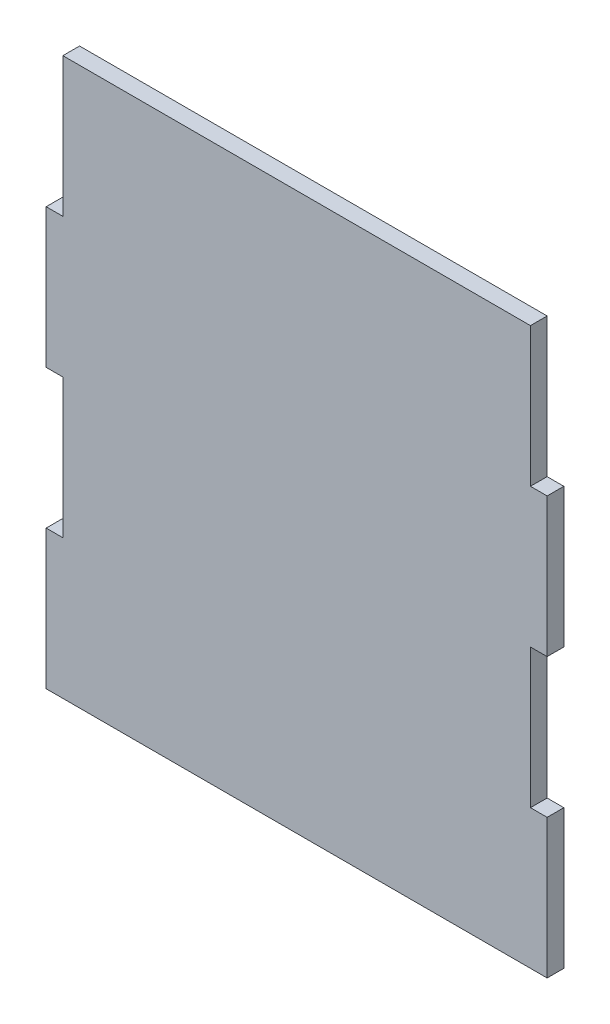
ISO-10303-21;
HEADER;
FILE_DESCRIPTION(('STEP AP214'),'2;1');
FILE_NAME('part.step','',(''),(''),'','','');
FILE_SCHEMA(('AUTOMOTIVE_DESIGN { 1 0 10303 214 1 1 1 1 }'));
ENDSEC;
DATA;
#1=APPLICATION_CONTEXT('core data for automotive mechanical design processes');
#2=APPLICATION_PROTOCOL_DEFINITION('international standard','automotive_design',2000,#1);
#3=PRODUCT_CONTEXT('',#1,'mechanical');
#4=PRODUCT('Part','Part','',(#3));
#5=PRODUCT_RELATED_PRODUCT_CATEGORY('part','',(#4));
#6=PRODUCT_DEFINITION_FORMATION('','',#4);
#7=PRODUCT_DEFINITION_CONTEXT('part definition',#1,'design');
#8=PRODUCT_DEFINITION('design','',#6,#7);
#9=PRODUCT_DEFINITION_SHAPE('','',#8);
#10=(LENGTH_UNIT() NAMED_UNIT(*) SI_UNIT(.MILLI.,.METRE.));
#11=(NAMED_UNIT(*) PLANE_ANGLE_UNIT() SI_UNIT($,.RADIAN.));
#12=(NAMED_UNIT(*) SI_UNIT($,.STERADIAN.) SOLID_ANGLE_UNIT());
#13=UNCERTAINTY_MEASURE_WITH_UNIT(LENGTH_MEASURE(1.E-05),#10,'distance_accuracy_value','');
#14=(GEOMETRIC_REPRESENTATION_CONTEXT(3) GLOBAL_UNCERTAINTY_ASSIGNED_CONTEXT((#13)) GLOBAL_UNIT_ASSIGNED_CONTEXT((#10,
#11,#12)) REPRESENTATION_CONTEXT('',''));
#15=CARTESIAN_POINT('',(0.,0.,0.));
#16=DIRECTION('',(0.,0.,1.));
#17=DIRECTION('',(1.,0.,0.));
#18=AXIS2_PLACEMENT_3D('',#15,#16,#17);
#19=CARTESIAN_POINT('',(0.,0.,3.));
#20=DIRECTION('',(1.,0.,0.));
#21=DIRECTION('',(0.,0.,-1.));
#22=AXIS2_PLACEMENT_3D('',#19,#20,#21);
#23=PLANE('',#22);
#24=DIRECTION('',(0.,-1.,0.));
#25=VECTOR('',#24,1.);
#26=CARTESIAN_POINT('',(0.,0.,0.));
#27=LINE('',#26,#25);
#28=CARTESIAN_POINT('',(0.,75.,0.));
#29=VERTEX_POINT('',#28);
#30=CARTESIAN_POINT('',(0.,50.,0.));
#31=VERTEX_POINT('',#30);
#32=EDGE_CURVE('E203',#29,#31,#27,.T.);
#33=ORIENTED_EDGE('',*,*,#32,.T.);
#34=DIRECTION('',(0.,0.,1.));
#35=VECTOR('',#34,1.);
#36=CARTESIAN_POINT('',(0.,50.,0.));
#37=LINE('',#36,#35);
#38=CARTESIAN_POINT('',(0.,50.,3.));
#39=VERTEX_POINT('',#38);
#40=EDGE_CURVE('E251',#31,#39,#37,.T.);
#41=ORIENTED_EDGE('',*,*,#40,.T.);
#42=DIRECTION('',(0.,-1.,0.));
#43=VECTOR('',#42,1.);
#44=CARTESIAN_POINT('',(0.,0.,3.));
#45=LINE('',#44,#43);
#46=CARTESIAN_POINT('',(0.,75.,3.));
#47=VERTEX_POINT('',#46);
#48=EDGE_CURVE('E321',#47,#39,#45,.T.);
#49=ORIENTED_EDGE('',*,*,#48,.F.);
#50=DIRECTION('',(0.,0.,1.));
#51=VECTOR('',#50,1.);
#52=CARTESIAN_POINT('',(0.,75.,0.));
#53=LINE('',#52,#51);
#54=EDGE_CURVE('E307',#29,#47,#53,.T.);
#55=ORIENTED_EDGE('',*,*,#54,.F.);
#56=EDGE_LOOP('',(#33,#41,#49,#55));
#57=FACE_BOUND('',#56,.T.);
#58=ADVANCED_FACE('F43',(#57),#23,.F.);
#59=CARTESIAN_POINT('',(90.,0.,3.));
#60=DIRECTION('',(-1.,0.,0.));
#61=DIRECTION('',(0.,0.,1.));
#62=AXIS2_PLACEMENT_3D('',#59,#60,#61);
#63=PLANE('',#62);
#64=DIRECTION('',(0.,1.,0.));
#65=VECTOR('',#64,1.);
#66=CARTESIAN_POINT('',(90.,0.,0.));
#67=LINE('',#66,#65);
#68=CARTESIAN_POINT('',(90.,0.,0.));
#69=VERTEX_POINT('',#68);
#70=CARTESIAN_POINT('',(90.,25.,0.));
#71=VERTEX_POINT('',#70);
#72=EDGE_CURVE('E178',#69,#71,#67,.T.);
#73=ORIENTED_EDGE('',*,*,#72,.T.);
#74=DIRECTION('',(0.,0.,1.));
#75=VECTOR('',#74,1.);
#76=CARTESIAN_POINT('',(90.,25.,0.));
#77=LINE('',#76,#75);
#78=CARTESIAN_POINT('',(90.,25.,3.));
#79=VERTEX_POINT('',#78);
#80=EDGE_CURVE('E160',#71,#79,#77,.T.);
#81=ORIENTED_EDGE('',*,*,#80,.T.);
#82=DIRECTION('',(0.,1.,0.));
#83=VECTOR('',#82,1.);
#84=CARTESIAN_POINT('',(90.,0.,3.));
#85=LINE('',#84,#83);
#86=CARTESIAN_POINT('',(90.,0.,3.));
#87=VERTEX_POINT('',#86);
#88=EDGE_CURVE('E176',#87,#79,#85,.T.);
#89=ORIENTED_EDGE('',*,*,#88,.F.);
#90=DIRECTION('',(0.,0.,-1.));
#91=VECTOR('',#90,1.);
#92=CARTESIAN_POINT('',(90.,0.,3.));
#93=LINE('',#92,#91);
#94=EDGE_CURVE('E52',#87,#69,#93,.T.);
#95=ORIENTED_EDGE('',*,*,#94,.T.);
#96=EDGE_LOOP('',(#73,#81,#89,#95));
#97=FACE_BOUND('',#96,.T.);
#98=ADVANCED_FACE('F174',(#97),#63,.F.);
#99=CARTESIAN_POINT('',(0.,25.,3.));
#100=VERTEX_POINT('',#99);
#101=CARTESIAN_POINT('',(0.,0.,3.));
#102=VERTEX_POINT('',#101);
#103=EDGE_CURVE('E214',#100,#102,#45,.T.);
#104=ORIENTED_EDGE('',*,*,#103,.F.);
#105=DIRECTION('',(0.,0.,1.));
#106=VECTOR('',#105,1.);
#107=CARTESIAN_POINT('',(0.,25.,0.));
#108=LINE('',#107,#106);
#109=CARTESIAN_POINT('',(0.,25.,0.));
#110=VERTEX_POINT('',#109);
#111=EDGE_CURVE('E241',#110,#100,#108,.T.);
#112=ORIENTED_EDGE('',*,*,#111,.F.);
#113=CARTESIAN_POINT('',(0.,0.,0.));
#114=VERTEX_POINT('',#113);
#115=EDGE_CURVE('E200',#110,#114,#27,.T.);
#116=ORIENTED_EDGE('',*,*,#115,.T.);
#117=DIRECTION('',(0.,0.,-1.));
#118=VECTOR('',#117,1.);
#119=CARTESIAN_POINT('',(0.,0.,3.));
#120=LINE('',#119,#118);
#121=EDGE_CURVE('E11',#102,#114,#120,.T.);
#122=ORIENTED_EDGE('',*,*,#121,.F.);
#123=EDGE_LOOP('',(#104,#112,#116,#122));
#124=FACE_BOUND('',#123,.T.);
#125=ADVANCED_FACE('F45',(#124),#23,.F.);
#126=CARTESIAN_POINT('',(0.,0.,3.));
#127=DIRECTION('',(0.,1.,0.));
#128=DIRECTION('',(0.,0.,1.));
#129=AXIS2_PLACEMENT_3D('',#126,#127,#128);
#130=PLANE('',#129);
#131=DIRECTION('',(1.,0.,0.));
#132=VECTOR('',#131,1.);
#133=CARTESIAN_POINT('',(0.,0.,0.));
#134=LINE('',#133,#132);
#135=EDGE_CURVE('E205',#114,#69,#134,.T.);
#136=ORIENTED_EDGE('',*,*,#135,.T.);
#137=ORIENTED_EDGE('',*,*,#94,.F.);
#138=DIRECTION('',(1.,0.,0.));
#139=VECTOR('',#138,1.);
#140=CARTESIAN_POINT('',(0.,0.,3.));
#141=LINE('',#140,#139);
#142=EDGE_CURVE('E184',#102,#87,#141,.T.);
#143=ORIENTED_EDGE('',*,*,#142,.F.);
#144=ORIENTED_EDGE('',*,*,#121,.T.);
#145=EDGE_LOOP('',(#136,#137,#143,#144));
#146=FACE_BOUND('',#145,.T.);
#147=ADVANCED_FACE('F347',(#146),#130,.F.);
#148=CARTESIAN_POINT('',(90.,50.,0.));
#149=VERTEX_POINT('',#148);
#150=CARTESIAN_POINT('',(90.,75.,0.));
#151=VERTEX_POINT('',#150);
#152=EDGE_CURVE('E208',#149,#151,#67,.T.);
#153=ORIENTED_EDGE('',*,*,#152,.T.);
#154=DIRECTION('',(0.,0.,1.));
#155=VECTOR('',#154,1.);
#156=CARTESIAN_POINT('',(90.,75.,0.));
#157=LINE('',#156,#155);
#158=CARTESIAN_POINT('',(90.,75.,3.));
#159=VERTEX_POINT('',#158);
#160=EDGE_CURVE('E282',#151,#159,#157,.T.);
#161=ORIENTED_EDGE('',*,*,#160,.T.);
#162=CARTESIAN_POINT('',(90.,50.,3.));
#163=VERTEX_POINT('',#162);
#164=EDGE_CURVE('E188',#163,#159,#85,.T.);
#165=ORIENTED_EDGE('',*,*,#164,.F.);
#166=DIRECTION('',(0.,0.,1.));
#167=VECTOR('',#166,1.);
#168=CARTESIAN_POINT('',(90.,50.,0.));
#169=LINE('',#168,#167);
#170=EDGE_CURVE('E227',#149,#163,#169,.T.);
#171=ORIENTED_EDGE('',*,*,#170,.F.);
#172=EDGE_LOOP('',(#153,#161,#165,#171));
#173=FACE_BOUND('',#172,.T.);
#174=ADVANCED_FACE('F349',(#173),#63,.F.);
#175=CARTESIAN_POINT('',(0.,100.,3.));
#176=DIRECTION('',(0.,-1.,0.));
#177=DIRECTION('',(0.,0.,-1.));
#178=AXIS2_PLACEMENT_3D('',#175,#176,#177);
#179=PLANE('',#178);
#180=DIRECTION('',(-1.,0.,0.));
#181=VECTOR('',#180,1.);
#182=CARTESIAN_POINT('',(0.,100.,3.));
#183=LINE('',#182,#181);
#184=CARTESIAN_POINT('',(87.,100.,3.));
#185=VERTEX_POINT('',#184);
#186=CARTESIAN_POINT('',(3.,100.,3.));
#187=VERTEX_POINT('',#186);
#188=EDGE_CURVE('E187',#185,#187,#183,.T.);
#189=ORIENTED_EDGE('',*,*,#188,.F.);
#190=DIRECTION('',(0.,0.,1.));
#191=VECTOR('',#190,1.);
#192=CARTESIAN_POINT('',(87.,100.,0.));
#193=LINE('',#192,#191);
#194=CARTESIAN_POINT('',(87.,100.,0.));
#195=VERTEX_POINT('',#194);
#196=EDGE_CURVE('E276',#195,#185,#193,.T.);
#197=ORIENTED_EDGE('',*,*,#196,.F.);
#198=DIRECTION('',(-1.,0.,0.));
#199=VECTOR('',#198,1.);
#200=CARTESIAN_POINT('',(0.,100.,0.));
#201=LINE('',#200,#199);
#202=CARTESIAN_POINT('',(3.,100.,0.));
#203=VERTEX_POINT('',#202);
#204=EDGE_CURVE('E211',#195,#203,#201,.T.);
#205=ORIENTED_EDGE('',*,*,#204,.T.);
#206=DIRECTION('',(0.,0.,1.));
#207=VECTOR('',#206,1.);
#208=CARTESIAN_POINT('',(3.,100.,0.));
#209=LINE('',#208,#207);
#210=EDGE_CURVE('E204',#203,#187,#209,.T.);
#211=ORIENTED_EDGE('',*,*,#210,.T.);
#212=EDGE_LOOP('',(#189,#197,#205,#211));
#213=FACE_BOUND('',#212,.T.);
#214=ADVANCED_FACE('F354',(#213),#179,.F.);
#215=CARTESIAN_POINT('',(0.,0.,3.));
#216=DIRECTION('',(0.,0.,-1.));
#217=DIRECTION('',(-1.,0.,0.));
#218=AXIS2_PLACEMENT_3D('',#215,#216,#217);
#219=PLANE('',#218);
#220=ORIENTED_EDGE('',*,*,#48,.T.);
#221=DIRECTION('',(-1.,0.,0.));
#222=VECTOR('',#221,1.);
#223=CARTESIAN_POINT('',(0.,50.,3.));
#224=LINE('',#223,#222);
#225=CARTESIAN_POINT('',(3.,50.,3.));
#226=VERTEX_POINT('',#225);
#227=EDGE_CURVE('E256',#226,#39,#224,.T.);
#228=ORIENTED_EDGE('',*,*,#227,.F.);
#229=DIRECTION('',(0.,1.,0.));
#230=VECTOR('',#229,1.);
#231=CARTESIAN_POINT('',(3.,50.,3.));
#232=LINE('',#231,#230);
#233=CARTESIAN_POINT('',(3.,25.,3.));
#234=VERTEX_POINT('',#233);
#235=EDGE_CURVE('E259',#234,#226,#232,.T.);
#236=ORIENTED_EDGE('',*,*,#235,.F.);
#237=DIRECTION('',(1.,0.,0.));
#238=VECTOR('',#237,1.);
#239=CARTESIAN_POINT('',(0.,25.,3.));
#240=LINE('',#239,#238);
#241=EDGE_CURVE('E264',#100,#234,#240,.T.);
#242=ORIENTED_EDGE('',*,*,#241,.F.);
#243=ORIENTED_EDGE('',*,*,#103,.T.);
#244=ORIENTED_EDGE('',*,*,#142,.T.);
#245=ORIENTED_EDGE('',*,*,#88,.T.);
#246=DIRECTION('',(1.,0.,0.));
#247=VECTOR('',#246,1.);
#248=CARTESIAN_POINT('',(90.,25.,3.));
#249=LINE('',#248,#247);
#250=CARTESIAN_POINT('',(87.,25.,3.));
#251=VERTEX_POINT('',#250);
#252=EDGE_CURVE('E156',#251,#79,#249,.T.);
#253=ORIENTED_EDGE('',*,*,#252,.F.);
#254=DIRECTION('',(0.,-1.,0.));
#255=VECTOR('',#254,1.);
#256=CARTESIAN_POINT('',(87.,50.,3.));
#257=LINE('',#256,#255);
#258=CARTESIAN_POINT('',(87.,50.,3.));
#259=VERTEX_POINT('',#258);
#260=EDGE_CURVE('E168',#259,#251,#257,.T.);
#261=ORIENTED_EDGE('',*,*,#260,.F.);
#262=DIRECTION('',(-1.,0.,0.));
#263=VECTOR('',#262,1.);
#264=CARTESIAN_POINT('',(90.,50.,3.));
#265=LINE('',#264,#263);
#266=EDGE_CURVE('E236',#163,#259,#265,.T.);
#267=ORIENTED_EDGE('',*,*,#266,.F.);
#268=ORIENTED_EDGE('',*,*,#164,.T.);
#269=DIRECTION('',(1.,0.,0.));
#270=VECTOR('',#269,1.);
#271=CARTESIAN_POINT('',(90.,75.,3.));
#272=LINE('',#271,#270);
#273=CARTESIAN_POINT('',(87.,75.,3.));
#274=VERTEX_POINT('',#273);
#275=EDGE_CURVE('E286',#274,#159,#272,.T.);
#276=ORIENTED_EDGE('',*,*,#275,.F.);
#277=DIRECTION('',(0.,-1.,0.));
#278=VECTOR('',#277,1.);
#279=CARTESIAN_POINT('',(87.,100.,3.));
#280=LINE('',#279,#278);
#281=EDGE_CURVE('E255',#185,#274,#280,.T.);
#282=ORIENTED_EDGE('',*,*,#281,.F.);
#283=ORIENTED_EDGE('',*,*,#188,.T.);
#284=DIRECTION('',(0.,1.,0.));
#285=VECTOR('',#284,1.);
#286=CARTESIAN_POINT('',(3.,100.,3.));
#287=LINE('',#286,#285);
#288=CARTESIAN_POINT('',(3.,75.,3.));
#289=VERTEX_POINT('',#288);
#290=EDGE_CURVE('E303',#289,#187,#287,.T.);
#291=ORIENTED_EDGE('',*,*,#290,.F.);
#292=DIRECTION('',(1.,0.,0.));
#293=VECTOR('',#292,1.);
#294=CARTESIAN_POINT('',(0.,75.,3.));
#295=LINE('',#294,#293);
#296=EDGE_CURVE('E268',#47,#289,#295,.T.);
#297=ORIENTED_EDGE('',*,*,#296,.F.);
#298=EDGE_LOOP('',(#220,#228,#236,#242,#243,#244,#245,#253,#261,#267,#268,#276,#282,#283,#291,#297));
#299=FACE_BOUND('',#298,.T.);
#300=ADVANCED_FACE('F182',(#299),#219,.F.);
#301=CARTESIAN_POINT('',(0.,0.,0.));
#302=DIRECTION('',(0.,0.,-1.));
#303=DIRECTION('',(-1.,0.,0.));
#304=AXIS2_PLACEMENT_3D('',#301,#302,#303);
#305=PLANE('',#304);
#306=DIRECTION('',(-1.,0.,0.));
#307=VECTOR('',#306,1.);
#308=CARTESIAN_POINT('',(0.,50.,0.));
#309=LINE('',#308,#307);
#310=CARTESIAN_POINT('',(3.,50.,0.));
#311=VERTEX_POINT('',#310);
#312=EDGE_CURVE('E244',#311,#31,#309,.T.);
#313=ORIENTED_EDGE('',*,*,#312,.T.);
#314=ORIENTED_EDGE('',*,*,#32,.F.);
#315=DIRECTION('',(1.,0.,0.));
#316=VECTOR('',#315,1.);
#317=CARTESIAN_POINT('',(0.,75.,0.));
#318=LINE('',#317,#316);
#319=CARTESIAN_POINT('',(3.,75.,0.));
#320=VERTEX_POINT('',#319);
#321=EDGE_CURVE('E298',#29,#320,#318,.T.);
#322=ORIENTED_EDGE('',*,*,#321,.T.);
#323=DIRECTION('',(0.,1.,0.));
#324=VECTOR('',#323,1.);
#325=CARTESIAN_POINT('',(3.,100.,0.));
#326=LINE('',#325,#324);
#327=EDGE_CURVE('E302',#320,#203,#326,.T.);
#328=ORIENTED_EDGE('',*,*,#327,.T.);
#329=ORIENTED_EDGE('',*,*,#204,.F.);
#330=DIRECTION('',(0.,-1.,0.));
#331=VECTOR('',#330,1.);
#332=CARTESIAN_POINT('',(87.,100.,0.));
#333=LINE('',#332,#331);
#334=CARTESIAN_POINT('',(87.,75.,0.));
#335=VERTEX_POINT('',#334);
#336=EDGE_CURVE('E289',#195,#335,#333,.T.);
#337=ORIENTED_EDGE('',*,*,#336,.T.);
#338=DIRECTION('',(1.,0.,0.));
#339=VECTOR('',#338,1.);
#340=CARTESIAN_POINT('',(90.,75.,0.));
#341=LINE('',#340,#339);
#342=EDGE_CURVE('E67',#335,#151,#341,.T.);
#343=ORIENTED_EDGE('',*,*,#342,.T.);
#344=ORIENTED_EDGE('',*,*,#152,.F.);
#345=DIRECTION('',(-1.,0.,0.));
#346=VECTOR('',#345,1.);
#347=CARTESIAN_POINT('',(90.,50.,0.));
#348=LINE('',#347,#346);
#349=CARTESIAN_POINT('',(87.,50.,0.));
#350=VERTEX_POINT('',#349);
#351=EDGE_CURVE('E169',#149,#350,#348,.T.);
#352=ORIENTED_EDGE('',*,*,#351,.T.);
#353=DIRECTION('',(0.,-1.,0.));
#354=VECTOR('',#353,1.);
#355=CARTESIAN_POINT('',(87.,50.,0.));
#356=LINE('',#355,#354);
#357=CARTESIAN_POINT('',(87.,25.,0.));
#358=VERTEX_POINT('',#357);
#359=EDGE_CURVE('E225',#350,#358,#356,.T.);
#360=ORIENTED_EDGE('',*,*,#359,.T.);
#361=DIRECTION('',(1.,0.,0.));
#362=VECTOR('',#361,1.);
#363=CARTESIAN_POINT('',(90.,25.,0.));
#364=LINE('',#363,#362);
#365=EDGE_CURVE('E223',#358,#71,#364,.T.);
#366=ORIENTED_EDGE('',*,*,#365,.T.);
#367=ORIENTED_EDGE('',*,*,#72,.F.);
#368=ORIENTED_EDGE('',*,*,#135,.F.);
#369=ORIENTED_EDGE('',*,*,#115,.F.);
#370=DIRECTION('',(1.,0.,0.));
#371=VECTOR('',#370,1.);
#372=CARTESIAN_POINT('',(0.,25.,0.));
#373=LINE('',#372,#371);
#374=CARTESIAN_POINT('',(3.,25.,0.));
#375=VERTEX_POINT('',#374);
#376=EDGE_CURVE('E260',#110,#375,#373,.T.);
#377=ORIENTED_EDGE('',*,*,#376,.T.);
#378=DIRECTION('',(0.,1.,0.));
#379=VECTOR('',#378,1.);
#380=CARTESIAN_POINT('',(3.,50.,0.));
#381=LINE('',#380,#379);
#382=EDGE_CURVE('E59',#375,#311,#381,.T.);
#383=ORIENTED_EDGE('',*,*,#382,.T.);
#384=EDGE_LOOP('',(#313,#314,#322,#328,#329,#337,#343,#344,#352,#360,#366,#367,#368,#369,#377,#383));
#385=FACE_BOUND('',#384,.T.);
#386=ADVANCED_FACE('F220',(#385),#305,.T.);
#387=CARTESIAN_POINT('',(3.,100.,0.));
#388=DIRECTION('',(1.,0.,0.));
#389=DIRECTION('',(0.,1.,0.));
#390=AXIS2_PLACEMENT_3D('',#387,#388,#389);
#391=PLANE('',#390);
#392=ORIENTED_EDGE('',*,*,#290,.T.);
#393=ORIENTED_EDGE('',*,*,#210,.F.);
#394=ORIENTED_EDGE('',*,*,#327,.F.);
#395=DIRECTION('',(0.,0.,1.));
#396=VECTOR('',#395,1.);
#397=CARTESIAN_POINT('',(3.,75.,0.));
#398=LINE('',#397,#396);
#399=EDGE_CURVE('E316',#320,#289,#398,.T.);
#400=ORIENTED_EDGE('',*,*,#399,.T.);
#401=EDGE_LOOP('',(#392,#393,#394,#400));
#402=FACE_BOUND('',#401,.T.);
#403=ADVANCED_FACE('F369',(#402),#391,.F.);
#404=CARTESIAN_POINT('',(0.,75.,0.));
#405=DIRECTION('',(0.,-1.,0.));
#406=DIRECTION('',(0.,0.,-1.));
#407=AXIS2_PLACEMENT_3D('',#404,#405,#406);
#408=PLANE('',#407);
#409=ORIENTED_EDGE('',*,*,#296,.T.);
#410=ORIENTED_EDGE('',*,*,#399,.F.);
#411=ORIENTED_EDGE('',*,*,#321,.F.);
#412=ORIENTED_EDGE('',*,*,#54,.T.);
#413=EDGE_LOOP('',(#409,#410,#411,#412));
#414=FACE_BOUND('',#413,.T.);
#415=ADVANCED_FACE('F372',(#414),#408,.F.);
#416=CARTESIAN_POINT('',(90.,25.,0.));
#417=DIRECTION('',(0.,-1.,0.));
#418=DIRECTION('',(0.,0.,-1.));
#419=AXIS2_PLACEMENT_3D('',#416,#417,#418);
#420=PLANE('',#419);
#421=ORIENTED_EDGE('',*,*,#252,.T.);
#422=ORIENTED_EDGE('',*,*,#80,.F.);
#423=ORIENTED_EDGE('',*,*,#365,.F.);
#424=DIRECTION('',(0.,0.,1.));
#425=VECTOR('',#424,1.);
#426=CARTESIAN_POINT('',(87.,25.,0.));
#427=LINE('',#426,#425);
#428=EDGE_CURVE('E162',#358,#251,#427,.T.);
#429=ORIENTED_EDGE('',*,*,#428,.T.);
#430=EDGE_LOOP('',(#421,#422,#423,#429));
#431=FACE_BOUND('',#430,.T.);
#432=ADVANCED_FACE('F158',(#431),#420,.F.);
#433=CARTESIAN_POINT('',(87.,50.,0.));
#434=DIRECTION('',(-1.,0.,0.));
#435=DIRECTION('',(0.,-1.,0.));
#436=AXIS2_PLACEMENT_3D('',#433,#434,#435);
#437=PLANE('',#436);
#438=ORIENTED_EDGE('',*,*,#260,.T.);
#439=ORIENTED_EDGE('',*,*,#428,.F.);
#440=ORIENTED_EDGE('',*,*,#359,.F.);
#441=DIRECTION('',(0.,0.,1.));
#442=VECTOR('',#441,1.);
#443=CARTESIAN_POINT('',(87.,50.,0.));
#444=LINE('',#443,#442);
#445=EDGE_CURVE('E233',#350,#259,#444,.T.);
#446=ORIENTED_EDGE('',*,*,#445,.T.);
#447=EDGE_LOOP('',(#438,#439,#440,#446));
#448=FACE_BOUND('',#447,.T.);
#449=ADVANCED_FACE('F396',(#448),#437,.F.);
#450=CARTESIAN_POINT('',(90.,50.,0.));
#451=DIRECTION('',(0.,1.,0.));
#452=DIRECTION('',(0.,0.,1.));
#453=AXIS2_PLACEMENT_3D('',#450,#451,#452);
#454=PLANE('',#453);
#455=ORIENTED_EDGE('',*,*,#266,.T.);
#456=ORIENTED_EDGE('',*,*,#445,.F.);
#457=ORIENTED_EDGE('',*,*,#351,.F.);
#458=ORIENTED_EDGE('',*,*,#170,.T.);
#459=EDGE_LOOP('',(#455,#456,#457,#458));
#460=FACE_BOUND('',#459,.T.);
#461=ADVANCED_FACE('F383',(#460),#454,.F.);
#462=CARTESIAN_POINT('',(90.,75.,0.));
#463=DIRECTION('',(0.,-1.,0.));
#464=DIRECTION('',(0.,0.,-1.));
#465=AXIS2_PLACEMENT_3D('',#462,#463,#464);
#466=PLANE('',#465);
#467=ORIENTED_EDGE('',*,*,#275,.T.);
#468=ORIENTED_EDGE('',*,*,#160,.F.);
#469=ORIENTED_EDGE('',*,*,#342,.F.);
#470=DIRECTION('',(0.,0.,1.));
#471=VECTOR('',#470,1.);
#472=CARTESIAN_POINT('',(87.,75.,0.));
#473=LINE('',#472,#471);
#474=EDGE_CURVE('E279',#335,#274,#473,.T.);
#475=ORIENTED_EDGE('',*,*,#474,.T.);
#476=EDGE_LOOP('',(#467,#468,#469,#475));
#477=FACE_BOUND('',#476,.T.);
#478=ADVANCED_FACE('F379',(#477),#466,.F.);
#479=CARTESIAN_POINT('',(87.,100.,0.));
#480=DIRECTION('',(-1.,0.,0.));
#481=DIRECTION('',(0.,0.,1.));
#482=AXIS2_PLACEMENT_3D('',#479,#480,#481);
#483=PLANE('',#482);
#484=ORIENTED_EDGE('',*,*,#281,.T.);
#485=ORIENTED_EDGE('',*,*,#474,.F.);
#486=ORIENTED_EDGE('',*,*,#336,.F.);
#487=ORIENTED_EDGE('',*,*,#196,.T.);
#488=EDGE_LOOP('',(#484,#485,#486,#487));
#489=FACE_BOUND('',#488,.T.);
#490=ADVANCED_FACE('F382',(#489),#483,.F.);
#491=CARTESIAN_POINT('',(0.,50.,0.));
#492=DIRECTION('',(0.,1.,0.));
#493=DIRECTION('',(0.,0.,1.));
#494=AXIS2_PLACEMENT_3D('',#491,#492,#493);
#495=PLANE('',#494);
#496=ORIENTED_EDGE('',*,*,#227,.T.);
#497=ORIENTED_EDGE('',*,*,#40,.F.);
#498=ORIENTED_EDGE('',*,*,#312,.F.);
#499=DIRECTION('',(0.,0.,1.));
#500=VECTOR('',#499,1.);
#501=CARTESIAN_POINT('',(3.,50.,0.));
#502=LINE('',#501,#500);
#503=EDGE_CURVE('E248',#311,#226,#502,.T.);
#504=ORIENTED_EDGE('',*,*,#503,.T.);
#505=EDGE_LOOP('',(#496,#497,#498,#504));
#506=FACE_BOUND('',#505,.T.);
#507=ADVANCED_FACE('F341',(#506),#495,.F.);
#508=CARTESIAN_POINT('',(3.,50.,0.));
#509=DIRECTION('',(1.,0.,0.));
#510=DIRECTION('',(0.,1.,0.));
#511=AXIS2_PLACEMENT_3D('',#508,#509,#510);
#512=PLANE('',#511);
#513=ORIENTED_EDGE('',*,*,#235,.T.);
#514=ORIENTED_EDGE('',*,*,#503,.F.);
#515=ORIENTED_EDGE('',*,*,#382,.F.);
#516=DIRECTION('',(0.,0.,1.));
#517=VECTOR('',#516,1.);
#518=CARTESIAN_POINT('',(3.,25.,0.));
#519=LINE('',#518,#517);
#520=EDGE_CURVE('E245',#375,#234,#519,.T.);
#521=ORIENTED_EDGE('',*,*,#520,.T.);
#522=EDGE_LOOP('',(#513,#514,#515,#521));
#523=FACE_BOUND('',#522,.T.);
#524=ADVANCED_FACE('F389',(#523),#512,.F.);
#525=CARTESIAN_POINT('',(0.,25.,0.));
#526=DIRECTION('',(0.,-1.,0.));
#527=DIRECTION('',(0.,0.,-1.));
#528=AXIS2_PLACEMENT_3D('',#525,#526,#527);
#529=PLANE('',#528);
#530=ORIENTED_EDGE('',*,*,#241,.T.);
#531=ORIENTED_EDGE('',*,*,#520,.F.);
#532=ORIENTED_EDGE('',*,*,#376,.F.);
#533=ORIENTED_EDGE('',*,*,#111,.T.);
#534=EDGE_LOOP('',(#530,#531,#532,#533));
#535=FACE_BOUND('',#534,.T.);
#536=ADVANCED_FACE('F344',(#535),#529,.F.);
#537=CLOSED_SHELL('',(#58,#98,#125,#147,#174,#214,#300,#386,#403,#415,#432,#449,#461,#478,#490,
#507,#524,#536));
#538=MANIFOLD_SOLID_BREP('B2',#537);
#539=ADVANCED_BREP_SHAPE_REPRESENTATION('',(#18,#538),#14);
#540=SHAPE_DEFINITION_REPRESENTATION(#9,#539);
ENDSEC;
END-ISO-10303-21;
